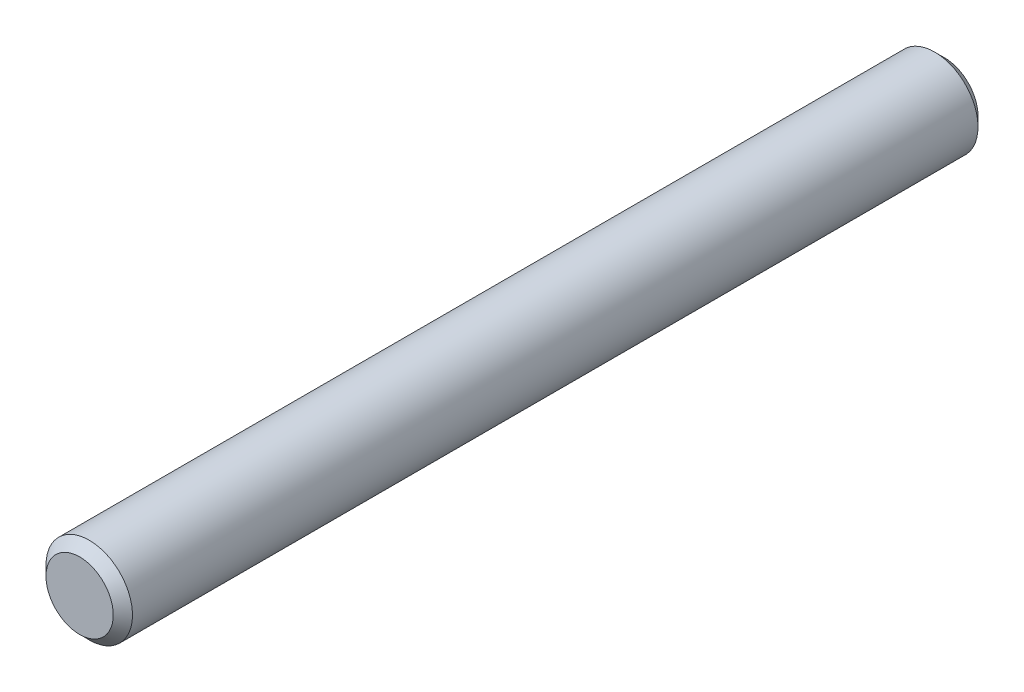
ISO-10303-21;
HEADER;
FILE_DESCRIPTION(('STEP AP214'),'2;1');
FILE_NAME('part.step','',(''),(''),'','','');
FILE_SCHEMA(('AUTOMOTIVE_DESIGN { 1 0 10303 214 1 1 1 1 }'));
ENDSEC;
DATA;
#1=APPLICATION_CONTEXT('core data for automotive mechanical design processes');
#2=APPLICATION_PROTOCOL_DEFINITION('international standard','automotive_design',2000,#1);
#3=PRODUCT_CONTEXT('',#1,'mechanical');
#4=PRODUCT('Part','Part','',(#3));
#5=PRODUCT_RELATED_PRODUCT_CATEGORY('part','',(#4));
#6=PRODUCT_DEFINITION_FORMATION('','',#4);
#7=PRODUCT_DEFINITION_CONTEXT('part definition',#1,'design');
#8=PRODUCT_DEFINITION('design','',#6,#7);
#9=PRODUCT_DEFINITION_SHAPE('','',#8);
#10=(LENGTH_UNIT() NAMED_UNIT(*) SI_UNIT(.MILLI.,.METRE.));
#11=(NAMED_UNIT(*) PLANE_ANGLE_UNIT() SI_UNIT($,.RADIAN.));
#12=(NAMED_UNIT(*) SI_UNIT($,.STERADIAN.) SOLID_ANGLE_UNIT());
#13=UNCERTAINTY_MEASURE_WITH_UNIT(LENGTH_MEASURE(1.E-05),#10,'distance_accuracy_value','');
#14=(GEOMETRIC_REPRESENTATION_CONTEXT(3) GLOBAL_UNCERTAINTY_ASSIGNED_CONTEXT((#13)) GLOBAL_UNIT_ASSIGNED_CONTEXT((#10,
#11,#12)) REPRESENTATION_CONTEXT('',''));
#15=CARTESIAN_POINT('',(0.,0.,0.));
#16=DIRECTION('',(0.,0.,1.));
#17=DIRECTION('',(1.,0.,0.));
#18=AXIS2_PLACEMENT_3D('',#15,#16,#17);
#19=CARTESIAN_POINT('',(0.,0.,45.));
#20=DIRECTION('',(0.,0.,-1.));
#21=DIRECTION('',(-1.,0.,0.));
#22=AXIS2_PLACEMENT_3D('',#19,#20,#21);
#23=CYLINDRICAL_SURFACE('',#22,2.25);
#24=CARTESIAN_POINT('',(0.,0.,0.500000000000042));
#25=DIRECTION('',(0.,0.,1.));
#26=DIRECTION('',(1.,0.,0.));
#27=AXIS2_PLACEMENT_3D('',#24,#25,#26);
#28=CIRCLE('',#27,2.25);
#29=CARTESIAN_POINT('',(-2.25,0.,0.500000000000035));
#30=VERTEX_POINT('',#29);
#31=EDGE_CURVE('E41',#30,#30,#28,.T.);
#32=CARTESIAN_POINT('',(0.,0.,44.5));
#33=DIRECTION('',(0.,0.,1.));
#34=DIRECTION('',(1.,0.,0.));
#35=AXIS2_PLACEMENT_3D('',#32,#33,#34);
#36=CIRCLE('',#35,2.25);
#37=CARTESIAN_POINT('',(-2.25,0.,44.5));
#38=VERTEX_POINT('',#37);
#39=EDGE_CURVE('E45',#38,#38,#36,.F.);
#40=CARTESIAN_POINT('',(-2.25,0.,0.500000000000035));
#41=CARTESIAN_POINT('',(-2.25,0.,0.958333333333369));
#42=CARTESIAN_POINT('',(-2.25,0.,1.4166666666667));
#43=CARTESIAN_POINT('',(-2.25,0.,2.33333333333337));
#44=CARTESIAN_POINT('',(-2.25,0.,2.7916666666667));
#45=CARTESIAN_POINT('',(-2.25,0.,3.70833333333337));
#46=CARTESIAN_POINT('',(-2.25,0.,4.1666666666667));
#47=CARTESIAN_POINT('',(-2.25,0.,5.08333333333337));
#48=CARTESIAN_POINT('',(-2.25,0.,5.5416666666667));
#49=CARTESIAN_POINT('',(-2.25,0.,6.45833333333337));
#50=CARTESIAN_POINT('',(-2.25,0.,6.9166666666667));
#51=CARTESIAN_POINT('',(-2.25,0.,7.83333333333337));
#52=CARTESIAN_POINT('',(-2.25,0.,8.2916666666667));
#53=CARTESIAN_POINT('',(-2.25,0.,9.20833333333336));
#54=CARTESIAN_POINT('',(-2.25,0.,9.6666666666667));
#55=CARTESIAN_POINT('',(-2.25,0.,10.5833333333334));
#56=CARTESIAN_POINT('',(-2.25,0.,11.0416666666667));
#57=CARTESIAN_POINT('',(-2.25,0.,11.9583333333334));
#58=CARTESIAN_POINT('',(-2.25,0.,12.4166666666667));
#59=CARTESIAN_POINT('',(-2.25,0.,13.3333333333334));
#60=CARTESIAN_POINT('',(-2.25,0.,13.7916666666667));
#61=CARTESIAN_POINT('',(-2.25,0.,14.7083333333334));
#62=CARTESIAN_POINT('',(-2.25,0.,15.1666666666667));
#63=CARTESIAN_POINT('',(-2.25,0.,16.0833333333334));
#64=CARTESIAN_POINT('',(-2.25,0.,16.5416666666667));
#65=CARTESIAN_POINT('',(-2.25,0.,17.4583333333334));
#66=CARTESIAN_POINT('',(-2.25,0.,17.9166666666667));
#67=CARTESIAN_POINT('',(-2.25,0.,18.8333333333334));
#68=CARTESIAN_POINT('',(-2.25,0.,19.2916666666667));
#69=CARTESIAN_POINT('',(-2.25,0.,20.2083333333334));
#70=CARTESIAN_POINT('',(-2.25,0.,20.6666666666667));
#71=CARTESIAN_POINT('',(-2.25,0.,21.5833333333334));
#72=CARTESIAN_POINT('',(-2.25,0.,22.0416666666667));
#73=CARTESIAN_POINT('',(-2.25,0.,22.9583333333334));
#74=CARTESIAN_POINT('',(-2.25,0.,23.4166666666667));
#75=CARTESIAN_POINT('',(-2.25,0.,24.3333333333334));
#76=CARTESIAN_POINT('',(-2.25,0.,24.7916666666667));
#77=CARTESIAN_POINT('',(-2.25,0.,25.7083333333334));
#78=CARTESIAN_POINT('',(-2.25,0.,26.1666666666667));
#79=CARTESIAN_POINT('',(-2.25,0.,27.0833333333334));
#80=CARTESIAN_POINT('',(-2.25,0.,27.5416666666667));
#81=CARTESIAN_POINT('',(-2.25,0.,28.4583333333334));
#82=CARTESIAN_POINT('',(-2.25,0.,28.9166666666667));
#83=CARTESIAN_POINT('',(-2.25,0.,29.8333333333334));
#84=CARTESIAN_POINT('',(-2.25,0.,30.2916666666667));
#85=CARTESIAN_POINT('',(-2.25,0.,31.2083333333334));
#86=CARTESIAN_POINT('',(-2.25,0.,31.6666666666667));
#87=CARTESIAN_POINT('',(-2.25,0.,32.5833333333333));
#88=CARTESIAN_POINT('',(-2.25,0.,33.0416666666667));
#89=CARTESIAN_POINT('',(-2.25,0.,33.9583333333333));
#90=CARTESIAN_POINT('',(-2.25,0.,34.4166666666667));
#91=CARTESIAN_POINT('',(-2.25,0.,35.3333333333333));
#92=CARTESIAN_POINT('',(-2.25,0.,35.7916666666667));
#93=CARTESIAN_POINT('',(-2.25,0.,36.7083333333333));
#94=CARTESIAN_POINT('',(-2.25,0.,37.1666666666667));
#95=CARTESIAN_POINT('',(-2.25,0.,38.0833333333333));
#96=CARTESIAN_POINT('',(-2.25,0.,38.5416666666667));
#97=CARTESIAN_POINT('',(-2.25,0.,39.4583333333333));
#98=CARTESIAN_POINT('',(-2.25,0.,39.9166666666667));
#99=CARTESIAN_POINT('',(-2.25,0.,40.8333333333333));
#100=CARTESIAN_POINT('',(-2.25,0.,41.2916666666667));
#101=CARTESIAN_POINT('',(-2.25,0.,42.2083333333333));
#102=CARTESIAN_POINT('',(-2.25,0.,42.6666666666667));
#103=CARTESIAN_POINT('',(-2.25,0.,43.5833333333333));
#104=CARTESIAN_POINT('',(-2.25,0.,44.0416666666667));
#105=CARTESIAN_POINT('',(-2.25,0.,44.5));
#106=B_SPLINE_CURVE_WITH_KNOTS('',3,(#40,#41,#42,#43,#44,#45,#46,#47,#48,#49,#50,#51,#52,#53,
#54,#55,#56,#57,#58,#59,#60,#61,#62,#63,#64,#65,#66,#67,#68,#69,#70,#71,#72,#73,#74,#75,#76,#77,
#78,#79,#80,#81,#82,#83,#84,#85,#86,#87,#88,#89,#90,#91,#92,#93,#94,#95,#96,#97,#98,#99,#100,
#101,#102,#103,#104,#105),.UNSPECIFIED.,.F.,.F.,(4,2,2,2,2,2,2,2,2,2,2,2,2,2,2,2,2,2,2,2,2,2,2,
2,2,2,2,2,2,2,2,2,4),(0.,1.375,2.75,4.125,5.5,6.875,8.24999999999999,9.62499999999999,11.,
12.375,13.75,15.125,16.5,17.875,19.25,20.625,22.,23.375,24.75,26.125,27.5,28.875,30.25,31.625,
33.,34.375,35.75,37.125,38.5,39.875,41.25,42.625,44.),.UNSPECIFIED.);
#107=EDGE_CURVE('BSEAM30',#30,#38,#106,.T.);
#108=ORIENTED_EDGE('',*,*,#31,.T.);
#109=ORIENTED_EDGE('',*,*,#39,.T.);
#110=ORIENTED_EDGE('',*,*,#107,.T.);
#111=ORIENTED_EDGE('',*,*,#107,.F.);
#112=EDGE_LOOP('',(#108,#110,#109,#111));
#113=FACE_BOUND('',#112,.T.);
#114=ADVANCED_FACE('F30',(#113),#23,.T.);
#115=CARTESIAN_POINT('',(0.,0.,45.));
#116=DIRECTION('',(0.,0.,1.));
#117=DIRECTION('',(1.,0.,0.));
#118=AXIS2_PLACEMENT_3D('',#115,#116,#117);
#119=PLANE('',#118);
#120=CARTESIAN_POINT('',(0.,0.,45.));
#121=DIRECTION('',(0.,0.,1.));
#122=DIRECTION('',(1.,0.,0.));
#123=AXIS2_PLACEMENT_3D('',#120,#121,#122);
#124=CIRCLE('',#123,1.75000000000002);
#125=CARTESIAN_POINT('',(1.75000000000002,0.,45.));
#126=VERTEX_POINT('',#125);
#127=EDGE_CURVE('E10',#126,#126,#124,.T.);
#128=ORIENTED_EDGE('',*,*,#127,.T.);
#129=EDGE_LOOP('',(#128));
#130=FACE_BOUND('',#129,.T.);
#131=ADVANCED_FACE('F61',(#130),#119,.T.);
#132=CARTESIAN_POINT('',(0.,0.,0.));
#133=DIRECTION('',(0.,0.,1.));
#134=DIRECTION('',(1.,0.,0.));
#135=AXIS2_PLACEMENT_3D('',#132,#133,#134);
#136=PLANE('',#135);
#137=CARTESIAN_POINT('',(0.,0.,0.));
#138=DIRECTION('',(0.,0.,1.));
#139=DIRECTION('',(1.,0.,0.));
#140=AXIS2_PLACEMENT_3D('',#137,#138,#139);
#141=CIRCLE('',#140,1.74999999999996);
#142=CARTESIAN_POINT('',(1.74999999999996,0.,0.));
#143=VERTEX_POINT('',#142);
#144=EDGE_CURVE('E37',#143,#143,#141,.F.);
#145=ORIENTED_EDGE('',*,*,#144,.T.);
#146=EDGE_LOOP('',(#145));
#147=FACE_BOUND('',#146,.T.);
#148=ADVANCED_FACE('F58',(#147),#136,.F.);
#149=CARTESIAN_POINT('',(0.,0.,0.500000000000042));
#150=DIRECTION('',(0.,0.,1.));
#151=DIRECTION('',(1.,0.,0.));
#152=AXIS2_PLACEMENT_3D('',#149,#150,#151);
#153=CONICAL_SURFACE('',#152,2.25,0.78539816339745);
#154=ORIENTED_EDGE('',*,*,#144,.F.);
#155=EDGE_LOOP('',(#154));
#156=FACE_BOUND('',#155,.T.);
#157=ORIENTED_EDGE('',*,*,#31,.F.);
#158=EDGE_LOOP('',(#157));
#159=FACE_BOUND('',#158,.T.);
#160=ADVANCED_FACE('F54',(#156,#159),#153,.T.);
#161=CARTESIAN_POINT('',(0.,0.,45.));
#162=DIRECTION('',(0.,0.,-1.));
#163=DIRECTION('',(-1.,0.,0.));
#164=AXIS2_PLACEMENT_3D('',#161,#162,#163);
#165=CONICAL_SURFACE('',#164,1.75000000000002,0.785398163397447);
#166=ORIENTED_EDGE('',*,*,#39,.F.);
#167=EDGE_LOOP('',(#166));
#168=FACE_BOUND('',#167,.T.);
#169=ORIENTED_EDGE('',*,*,#127,.F.);
#170=EDGE_LOOP('',(#169));
#171=FACE_BOUND('',#170,.T.);
#172=ADVANCED_FACE('F32',(#168,#171),#165,.T.);
#173=CLOSED_SHELL('',(#114,#131,#148,#160,#172));
#174=MANIFOLD_SOLID_BREP('B2',#173);
#175=ADVANCED_BREP_SHAPE_REPRESENTATION('',(#18,#174),#14);
#176=SHAPE_DEFINITION_REPRESENTATION(#9,#175);
ENDSEC;
END-ISO-10303-21;
